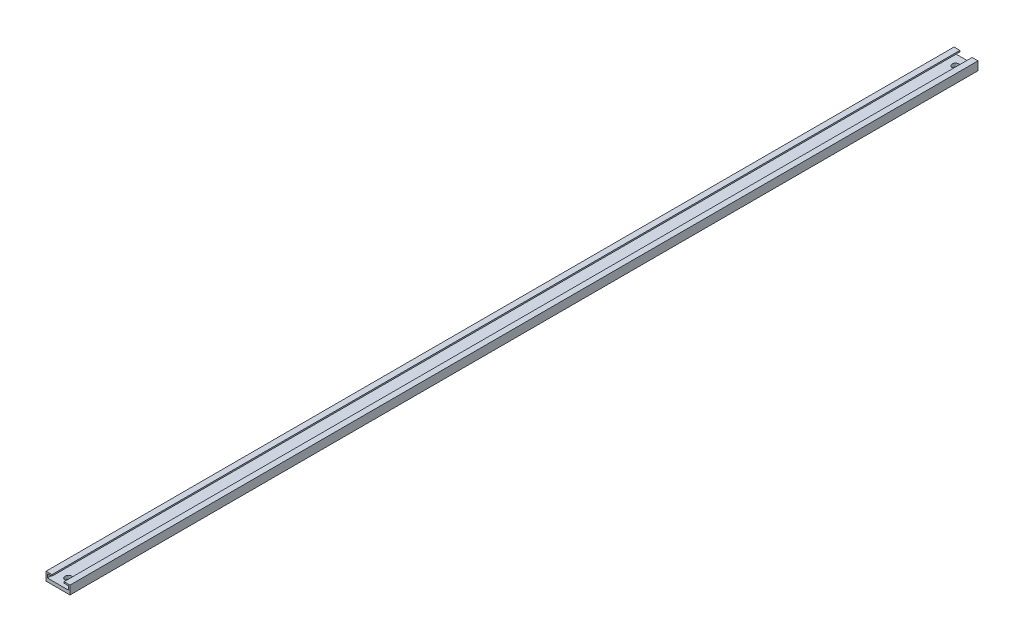
ISO-10303-21;
HEADER;
FILE_DESCRIPTION(('STEP AP214'),'2;1');
FILE_NAME('part.step','',(''),(''),'','','');
FILE_SCHEMA(('AUTOMOTIVE_DESIGN { 1 0 10303 214 1 1 1 1 }'));
ENDSEC;
DATA;
#1=APPLICATION_CONTEXT('core data for automotive mechanical design processes');
#2=APPLICATION_PROTOCOL_DEFINITION('international standard','automotive_design',2000,#1);
#3=PRODUCT_CONTEXT('',#1,'mechanical');
#4=PRODUCT('Part','Part','',(#3));
#5=PRODUCT_RELATED_PRODUCT_CATEGORY('part','',(#4));
#6=PRODUCT_DEFINITION_FORMATION('','',#4);
#7=PRODUCT_DEFINITION_CONTEXT('part definition',#1,'design');
#8=PRODUCT_DEFINITION('design','',#6,#7);
#9=PRODUCT_DEFINITION_SHAPE('','',#8);
#10=(LENGTH_UNIT() NAMED_UNIT(*) SI_UNIT(.MILLI.,.METRE.));
#11=(NAMED_UNIT(*) PLANE_ANGLE_UNIT() SI_UNIT($,.RADIAN.));
#12=(NAMED_UNIT(*) SI_UNIT($,.STERADIAN.) SOLID_ANGLE_UNIT());
#13=UNCERTAINTY_MEASURE_WITH_UNIT(LENGTH_MEASURE(1.E-05),#10,'distance_accuracy_value','');
#14=(GEOMETRIC_REPRESENTATION_CONTEXT(3) GLOBAL_UNCERTAINTY_ASSIGNED_CONTEXT((#13)) GLOBAL_UNIT_ASSIGNED_CONTEXT((#10,
#11,#12)) REPRESENTATION_CONTEXT('',''));
#15=CARTESIAN_POINT('',(0.,0.,0.));
#16=DIRECTION('',(0.,0.,1.));
#17=DIRECTION('',(1.,0.,0.));
#18=AXIS2_PLACEMENT_3D('',#15,#16,#17);
#19=CARTESIAN_POINT('',(-4.4,3.1,655.));
#20=DIRECTION('',(0.,-1.,0.));
#21=DIRECTION('',(1.,0.,0.));
#22=AXIS2_PLACEMENT_3D('',#19,#20,#21);
#23=PLANE('',#22);
#24=DIRECTION('',(-1.,0.,0.));
#25=VECTOR('',#24,1.);
#26=CARTESIAN_POINT('',(-4.4,3.1,0.));
#27=LINE('',#26,#25);
#28=CARTESIAN_POINT('',(-4.4,3.1,0.));
#29=VERTEX_POINT('',#28);
#30=CARTESIAN_POINT('',(-8.65,3.1,0.));
#31=VERTEX_POINT('',#30);
#32=EDGE_CURVE('E155',#29,#31,#27,.T.);
#33=ORIENTED_EDGE('',*,*,#32,.T.);
#34=DIRECTION('',(0.,0.,-1.));
#35=VECTOR('',#34,1.);
#36=CARTESIAN_POINT('',(-8.65,3.1,655.));
#37=LINE('',#36,#35);
#38=CARTESIAN_POINT('',(-8.65,3.1,655.));
#39=VERTEX_POINT('',#38);
#40=EDGE_CURVE('E11',#39,#31,#37,.T.);
#41=ORIENTED_EDGE('',*,*,#40,.F.);
#42=DIRECTION('',(-1.,0.,0.));
#43=VECTOR('',#42,1.);
#44=CARTESIAN_POINT('',(-4.4,3.1,655.));
#45=LINE('',#44,#43);
#46=CARTESIAN_POINT('',(-4.4,3.1,655.));
#47=VERTEX_POINT('',#46);
#48=EDGE_CURVE('E178',#47,#39,#45,.T.);
#49=ORIENTED_EDGE('',*,*,#48,.F.);
#50=DIRECTION('',(0.,0.,-1.));
#51=VECTOR('',#50,1.);
#52=CARTESIAN_POINT('',(-4.4,3.1,655.));
#53=LINE('',#52,#51);
#54=EDGE_CURVE('E151',#47,#29,#53,.T.);
#55=ORIENTED_EDGE('',*,*,#54,.T.);
#56=EDGE_LOOP('',(#33,#41,#49,#55));
#57=FACE_BOUND('',#56,.T.);
#58=ADVANCED_FACE('F35',(#57),#23,.F.);
#59=CARTESIAN_POINT('',(-8.65,-3.1,655.));
#60=DIRECTION('',(1.,0.,0.));
#61=DIRECTION('',(0.,0.,-1.));
#62=AXIS2_PLACEMENT_3D('',#59,#60,#61);
#63=PLANE('',#62);
#64=DIRECTION('',(0.,-1.,0.));
#65=VECTOR('',#64,1.);
#66=CARTESIAN_POINT('',(-8.65,-3.1,0.));
#67=LINE('',#66,#65);
#68=CARTESIAN_POINT('',(-8.65,-3.1,0.));
#69=VERTEX_POINT('',#68);
#70=EDGE_CURVE('E158',#31,#69,#67,.T.);
#71=ORIENTED_EDGE('',*,*,#70,.T.);
#72=DIRECTION('',(0.,0.,-1.));
#73=VECTOR('',#72,1.);
#74=CARTESIAN_POINT('',(-8.65,-3.1,655.));
#75=LINE('',#74,#73);
#76=CARTESIAN_POINT('',(-8.65,-3.1,655.));
#77=VERTEX_POINT('',#76);
#78=EDGE_CURVE('E43',#77,#69,#75,.T.);
#79=ORIENTED_EDGE('',*,*,#78,.F.);
#80=DIRECTION('',(0.,-1.,0.));
#81=VECTOR('',#80,1.);
#82=CARTESIAN_POINT('',(-8.65,-3.1,655.));
#83=LINE('',#82,#81);
#84=EDGE_CURVE('E106',#39,#77,#83,.T.);
#85=ORIENTED_EDGE('',*,*,#84,.F.);
#86=ORIENTED_EDGE('',*,*,#40,.T.);
#87=EDGE_LOOP('',(#71,#79,#85,#86));
#88=FACE_BOUND('',#87,.T.);
#89=ADVANCED_FACE('F256',(#88),#63,.F.);
#90=CARTESIAN_POINT('',(8.65,-3.1,655.));
#91=DIRECTION('',(0.,1.,0.));
#92=DIRECTION('',(-1.,0.,0.));
#93=AXIS2_PLACEMENT_3D('',#90,#91,#92);
#94=PLANE('',#93);
#95=CARTESIAN_POINT('',(0.,-3.1,7.49999999999984));
#96=DIRECTION('',(0.,1.,0.));
#97=DIRECTION('',(1.,0.,0.));
#98=AXIS2_PLACEMENT_3D('',#95,#96,#97);
#99=CIRCLE('',#98,2.3999999999999);
#100=CARTESIAN_POINT('',(2.3999999999999,-3.1,7.49999999999984));
#101=VERTEX_POINT('',#100);
#102=EDGE_CURVE('E350',#101,#101,#99,.T.);
#103=ORIENTED_EDGE('',*,*,#102,.T.);
#104=EDGE_LOOP('',(#103));
#105=FACE_BOUND('',#104,.T.);
#106=CARTESIAN_POINT('',(0.,-3.1,647.5));
#107=DIRECTION('',(0.,-1.,0.));
#108=DIRECTION('',(1.,0.,0.));
#109=AXIS2_PLACEMENT_3D('',#106,#107,#108);
#110=CIRCLE('',#109,2.3999999999999);
#111=CARTESIAN_POINT('',(2.3999999999999,-3.1,647.5));
#112=VERTEX_POINT('',#111);
#113=EDGE_CURVE('E355',#112,#112,#110,.T.);
#114=ORIENTED_EDGE('',*,*,#113,.F.);
#115=EDGE_LOOP('',(#114));
#116=FACE_BOUND('',#115,.T.);
#117=DIRECTION('',(1.,0.,0.));
#118=VECTOR('',#117,1.);
#119=CARTESIAN_POINT('',(8.65,-3.1,0.));
#120=LINE('',#119,#118);
#121=CARTESIAN_POINT('',(8.65,-3.1,0.));
#122=VERTEX_POINT('',#121);
#123=EDGE_CURVE('E161',#69,#122,#120,.T.);
#124=ORIENTED_EDGE('',*,*,#123,.T.);
#125=DIRECTION('',(0.,0.,-1.));
#126=VECTOR('',#125,1.);
#127=CARTESIAN_POINT('',(8.65,-3.1,655.));
#128=LINE('',#127,#126);
#129=CARTESIAN_POINT('',(8.65,-3.1,655.));
#130=VERTEX_POINT('',#129);
#131=EDGE_CURVE('E197',#130,#122,#128,.T.);
#132=ORIENTED_EDGE('',*,*,#131,.F.);
#133=DIRECTION('',(1.,0.,0.));
#134=VECTOR('',#133,1.);
#135=CARTESIAN_POINT('',(8.65,-3.1,655.));
#136=LINE('',#135,#134);
#137=EDGE_CURVE('E205',#77,#130,#136,.T.);
#138=ORIENTED_EDGE('',*,*,#137,.F.);
#139=ORIENTED_EDGE('',*,*,#78,.T.);
#140=EDGE_LOOP('',(#124,#132,#138,#139));
#141=FACE_BOUND('',#140,.T.);
#142=ADVANCED_FACE('F203',(#105,#116,#141),#94,.F.);
#143=CARTESIAN_POINT('',(8.65,-3.1,655.));
#144=DIRECTION('',(-1.,0.,0.));
#145=DIRECTION('',(0.,0.,1.));
#146=AXIS2_PLACEMENT_3D('',#143,#144,#145);
#147=PLANE('',#146);
#148=DIRECTION('',(0.,1.,0.));
#149=VECTOR('',#148,1.);
#150=CARTESIAN_POINT('',(8.65,-3.1,0.));
#151=LINE('',#150,#149);
#152=CARTESIAN_POINT('',(8.65,3.1,0.));
#153=VERTEX_POINT('',#152);
#154=EDGE_CURVE('E163',#122,#153,#151,.T.);
#155=ORIENTED_EDGE('',*,*,#154,.T.);
#156=DIRECTION('',(0.,0.,-1.));
#157=VECTOR('',#156,1.);
#158=CARTESIAN_POINT('',(8.65,3.1,655.));
#159=LINE('',#158,#157);
#160=CARTESIAN_POINT('',(8.65,3.1,655.));
#161=VERTEX_POINT('',#160);
#162=EDGE_CURVE('E194',#161,#153,#159,.T.);
#163=ORIENTED_EDGE('',*,*,#162,.F.);
#164=DIRECTION('',(0.,1.,0.));
#165=VECTOR('',#164,1.);
#166=CARTESIAN_POINT('',(8.65,-3.1,655.));
#167=LINE('',#166,#165);
#168=EDGE_CURVE('E223',#130,#161,#167,.T.);
#169=ORIENTED_EDGE('',*,*,#168,.F.);
#170=ORIENTED_EDGE('',*,*,#131,.T.);
#171=EDGE_LOOP('',(#155,#163,#169,#170));
#172=FACE_BOUND('',#171,.T.);
#173=ADVANCED_FACE('F214',(#172),#147,.F.);
#174=CARTESIAN_POINT('',(8.65,3.1,655.));
#175=DIRECTION('',(0.,-1.,0.));
#176=DIRECTION('',(1.,0.,0.));
#177=AXIS2_PLACEMENT_3D('',#174,#175,#176);
#178=PLANE('',#177);
#179=DIRECTION('',(-1.,0.,0.));
#180=VECTOR('',#179,1.);
#181=CARTESIAN_POINT('',(8.65,3.1,0.));
#182=LINE('',#181,#180);
#183=CARTESIAN_POINT('',(4.4,3.1,0.));
#184=VERTEX_POINT('',#183);
#185=EDGE_CURVE('E165',#153,#184,#182,.T.);
#186=ORIENTED_EDGE('',*,*,#185,.T.);
#187=DIRECTION('',(0.,0.,-1.));
#188=VECTOR('',#187,1.);
#189=CARTESIAN_POINT('',(4.4,3.1,655.));
#190=LINE('',#189,#188);
#191=CARTESIAN_POINT('',(4.4,3.1,655.));
#192=VERTEX_POINT('',#191);
#193=EDGE_CURVE('E191',#192,#184,#190,.T.);
#194=ORIENTED_EDGE('',*,*,#193,.F.);
#195=DIRECTION('',(-1.,0.,0.));
#196=VECTOR('',#195,1.);
#197=CARTESIAN_POINT('',(8.65,3.1,655.));
#198=LINE('',#197,#196);
#199=EDGE_CURVE('E220',#161,#192,#198,.T.);
#200=ORIENTED_EDGE('',*,*,#199,.F.);
#201=ORIENTED_EDGE('',*,*,#162,.T.);
#202=EDGE_LOOP('',(#186,#194,#200,#201));
#203=FACE_BOUND('',#202,.T.);
#204=ADVANCED_FACE('F218',(#203),#178,.F.);
#205=CARTESIAN_POINT('',(4.4,3.1,655.));
#206=DIRECTION('',(1.,0.,0.));
#207=DIRECTION('',(0.,1.,0.));
#208=AXIS2_PLACEMENT_3D('',#205,#206,#207);
#209=PLANE('',#208);
#210=DIRECTION('',(0.,-1.,0.));
#211=VECTOR('',#210,1.);
#212=CARTESIAN_POINT('',(4.4,3.1,0.));
#213=LINE('',#212,#211);
#214=CARTESIAN_POINT('',(4.4,2.1,0.));
#215=VERTEX_POINT('',#214);
#216=EDGE_CURVE('E167',#184,#215,#213,.T.);
#217=ORIENTED_EDGE('',*,*,#216,.T.);
#218=DIRECTION('',(0.,0.,-1.));
#219=VECTOR('',#218,1.);
#220=CARTESIAN_POINT('',(4.4,2.1,655.));
#221=LINE('',#220,#219);
#222=CARTESIAN_POINT('',(4.4,2.1,655.));
#223=VERTEX_POINT('',#222);
#224=EDGE_CURVE('E188',#223,#215,#221,.T.);
#225=ORIENTED_EDGE('',*,*,#224,.F.);
#226=DIRECTION('',(0.,-1.,0.));
#227=VECTOR('',#226,1.);
#228=CARTESIAN_POINT('',(4.4,3.1,655.));
#229=LINE('',#228,#227);
#230=EDGE_CURVE('E222',#192,#223,#229,.T.);
#231=ORIENTED_EDGE('',*,*,#230,.F.);
#232=ORIENTED_EDGE('',*,*,#193,.T.);
#233=EDGE_LOOP('',(#217,#225,#231,#232));
#234=FACE_BOUND('',#233,.T.);
#235=ADVANCED_FACE('F270',(#234),#209,.F.);
#236=CARTESIAN_POINT('',(7.65,2.1,655.));
#237=DIRECTION('',(0.,1.,0.));
#238=DIRECTION('',(0.,0.,1.));
#239=AXIS2_PLACEMENT_3D('',#236,#237,#238);
#240=PLANE('',#239);
#241=DIRECTION('',(1.,0.,0.));
#242=VECTOR('',#241,1.);
#243=CARTESIAN_POINT('',(7.65,2.1,0.));
#244=LINE('',#243,#242);
#245=CARTESIAN_POINT('',(7.65,2.1,0.));
#246=VERTEX_POINT('',#245);
#247=EDGE_CURVE('E169',#215,#246,#244,.T.);
#248=ORIENTED_EDGE('',*,*,#247,.T.);
#249=DIRECTION('',(0.,0.,-1.));
#250=VECTOR('',#249,1.);
#251=CARTESIAN_POINT('',(7.65,2.1,655.));
#252=LINE('',#251,#250);
#253=CARTESIAN_POINT('',(7.65,2.1,655.));
#254=VERTEX_POINT('',#253);
#255=EDGE_CURVE('E185',#254,#246,#252,.T.);
#256=ORIENTED_EDGE('',*,*,#255,.F.);
#257=DIRECTION('',(1.,0.,0.));
#258=VECTOR('',#257,1.);
#259=CARTESIAN_POINT('',(7.65,2.1,655.));
#260=LINE('',#259,#258);
#261=EDGE_CURVE('E225',#223,#254,#260,.T.);
#262=ORIENTED_EDGE('',*,*,#261,.F.);
#263=ORIENTED_EDGE('',*,*,#224,.T.);
#264=EDGE_LOOP('',(#248,#256,#262,#263));
#265=FACE_BOUND('',#264,.T.);
#266=ADVANCED_FACE('F273',(#265),#240,.F.);
#267=CARTESIAN_POINT('',(7.65,2.1,655.));
#268=DIRECTION('',(1.,0.,0.));
#269=DIRECTION('',(0.,1.,0.));
#270=AXIS2_PLACEMENT_3D('',#267,#268,#269);
#271=PLANE('',#270);
#272=DIRECTION('',(0.,-1.,0.));
#273=VECTOR('',#272,1.);
#274=CARTESIAN_POINT('',(7.65,2.1,0.));
#275=LINE('',#274,#273);
#276=CARTESIAN_POINT('',(7.65,-0.600000000000001,0.));
#277=VERTEX_POINT('',#276);
#278=EDGE_CURVE('E171',#246,#277,#275,.T.);
#279=ORIENTED_EDGE('',*,*,#278,.T.);
#280=DIRECTION('',(0.,0.,-1.));
#281=VECTOR('',#280,1.);
#282=CARTESIAN_POINT('',(7.65,-0.600000000000001,655.));
#283=LINE('',#282,#281);
#284=CARTESIAN_POINT('',(7.65,-0.600000000000001,655.));
#285=VERTEX_POINT('',#284);
#286=EDGE_CURVE('E182',#285,#277,#283,.T.);
#287=ORIENTED_EDGE('',*,*,#286,.F.);
#288=DIRECTION('',(0.,-1.,0.));
#289=VECTOR('',#288,1.);
#290=CARTESIAN_POINT('',(7.65,2.1,655.));
#291=LINE('',#290,#289);
#292=EDGE_CURVE('E231',#254,#285,#291,.T.);
#293=ORIENTED_EDGE('',*,*,#292,.F.);
#294=ORIENTED_EDGE('',*,*,#255,.T.);
#295=EDGE_LOOP('',(#279,#287,#293,#294));
#296=FACE_BOUND('',#295,.T.);
#297=ADVANCED_FACE('F237',(#296),#271,.F.);
#298=CARTESIAN_POINT('',(7.65,-0.600000000000001,655.));
#299=DIRECTION('',(0.,-1.,0.));
#300=DIRECTION('',(0.,0.,-1.));
#301=AXIS2_PLACEMENT_3D('',#298,#299,#300);
#302=PLANE('',#301);
#303=CARTESIAN_POINT('',(0.,-0.6,7.49999999999984));
#304=DIRECTION('',(0.,-1.,0.));
#305=DIRECTION('',(0.,0.,-1.));
#306=AXIS2_PLACEMENT_3D('',#303,#304,#305);
#307=CIRCLE('',#306,2.3999999999999);
#308=CARTESIAN_POINT('',(0.,-0.6,5.09999999999994));
#309=VERTEX_POINT('',#308);
#310=EDGE_CURVE('E353',#309,#309,#307,.T.);
#311=ORIENTED_EDGE('',*,*,#310,.T.);
#312=EDGE_LOOP('',(#311));
#313=FACE_BOUND('',#312,.T.);
#314=CARTESIAN_POINT('',(0.,-0.6,647.5));
#315=DIRECTION('',(0.,-1.,0.));
#316=DIRECTION('',(0.,0.,-1.));
#317=AXIS2_PLACEMENT_3D('',#314,#315,#316);
#318=CIRCLE('',#317,2.3999999999999);
#319=CARTESIAN_POINT('',(0.,-0.6,645.1));
#320=VERTEX_POINT('',#319);
#321=EDGE_CURVE('E159',#320,#320,#318,.F.);
#322=ORIENTED_EDGE('',*,*,#321,.F.);
#323=EDGE_LOOP('',(#322));
#324=FACE_BOUND('',#323,.T.);
#325=DIRECTION('',(-1.,0.,0.));
#326=VECTOR('',#325,1.);
#327=CARTESIAN_POINT('',(7.65,-0.600000000000001,0.));
#328=LINE('',#327,#326);
#329=CARTESIAN_POINT('',(-7.65,-0.600000000000001,0.));
#330=VERTEX_POINT('',#329);
#331=EDGE_CURVE('E173',#277,#330,#328,.T.);
#332=ORIENTED_EDGE('',*,*,#331,.T.);
#333=DIRECTION('',(0.,0.,-1.));
#334=VECTOR('',#333,1.);
#335=CARTESIAN_POINT('',(-7.65,-0.600000000000001,655.));
#336=LINE('',#335,#334);
#337=CARTESIAN_POINT('',(-7.65,-0.600000000000001,655.));
#338=VERTEX_POINT('',#337);
#339=EDGE_CURVE('E146',#338,#330,#336,.T.);
#340=ORIENTED_EDGE('',*,*,#339,.F.);
#341=DIRECTION('',(-1.,0.,0.));
#342=VECTOR('',#341,1.);
#343=CARTESIAN_POINT('',(7.65,-0.600000000000001,655.));
#344=LINE('',#343,#342);
#345=EDGE_CURVE('E137',#285,#338,#344,.T.);
#346=ORIENTED_EDGE('',*,*,#345,.F.);
#347=ORIENTED_EDGE('',*,*,#286,.T.);
#348=EDGE_LOOP('',(#332,#340,#346,#347));
#349=FACE_BOUND('',#348,.T.);
#350=ADVANCED_FACE('F241',(#313,#324,#349),#302,.F.);
#351=CARTESIAN_POINT('',(-7.65,2.1,655.));
#352=DIRECTION('',(-1.,0.,0.));
#353=DIRECTION('',(0.,-1.,0.));
#354=AXIS2_PLACEMENT_3D('',#351,#352,#353);
#355=PLANE('',#354);
#356=DIRECTION('',(0.,1.,0.));
#357=VECTOR('',#356,1.);
#358=CARTESIAN_POINT('',(-7.65,2.1,0.));
#359=LINE('',#358,#357);
#360=CARTESIAN_POINT('',(-7.65,2.1,0.));
#361=VERTEX_POINT('',#360);
#362=EDGE_CURVE('E145',#330,#361,#359,.T.);
#363=ORIENTED_EDGE('',*,*,#362,.T.);
#364=DIRECTION('',(0.,0.,-1.));
#365=VECTOR('',#364,1.);
#366=CARTESIAN_POINT('',(-7.65,2.1,655.));
#367=LINE('',#366,#365);
#368=CARTESIAN_POINT('',(-7.65,2.1,655.));
#369=VERTEX_POINT('',#368);
#370=EDGE_CURVE('E142',#369,#361,#367,.T.);
#371=ORIENTED_EDGE('',*,*,#370,.F.);
#372=DIRECTION('',(0.,1.,0.));
#373=VECTOR('',#372,1.);
#374=CARTESIAN_POINT('',(-7.65,2.1,655.));
#375=LINE('',#374,#373);
#376=EDGE_CURVE('E131',#338,#369,#375,.T.);
#377=ORIENTED_EDGE('',*,*,#376,.F.);
#378=ORIENTED_EDGE('',*,*,#339,.T.);
#379=EDGE_LOOP('',(#363,#371,#377,#378));
#380=FACE_BOUND('',#379,.T.);
#381=ADVANCED_FACE('F143',(#380),#355,.F.);
#382=CARTESIAN_POINT('',(-4.4,2.1,655.));
#383=DIRECTION('',(0.,1.,0.));
#384=DIRECTION('',(0.,0.,1.));
#385=AXIS2_PLACEMENT_3D('',#382,#383,#384);
#386=PLANE('',#385);
#387=DIRECTION('',(1.,0.,0.));
#388=VECTOR('',#387,1.);
#389=CARTESIAN_POINT('',(-4.4,2.1,0.));
#390=LINE('',#389,#388);
#391=CARTESIAN_POINT('',(-4.4,2.1,0.));
#392=VERTEX_POINT('',#391);
#393=EDGE_CURVE('E92',#361,#392,#390,.T.);
#394=ORIENTED_EDGE('',*,*,#393,.T.);
#395=DIRECTION('',(0.,0.,-1.));
#396=VECTOR('',#395,1.);
#397=CARTESIAN_POINT('',(-4.4,2.1,655.));
#398=LINE('',#397,#396);
#399=CARTESIAN_POINT('',(-4.4,2.1,655.));
#400=VERTEX_POINT('',#399);
#401=EDGE_CURVE('E147',#400,#392,#398,.T.);
#402=ORIENTED_EDGE('',*,*,#401,.F.);
#403=DIRECTION('',(1.,0.,0.));
#404=VECTOR('',#403,1.);
#405=CARTESIAN_POINT('',(-4.4,2.1,655.));
#406=LINE('',#405,#404);
#407=EDGE_CURVE('E135',#369,#400,#406,.T.);
#408=ORIENTED_EDGE('',*,*,#407,.F.);
#409=ORIENTED_EDGE('',*,*,#370,.T.);
#410=EDGE_LOOP('',(#394,#402,#408,#409));
#411=FACE_BOUND('',#410,.T.);
#412=ADVANCED_FACE('F149',(#411),#386,.F.);
#413=CARTESIAN_POINT('',(-4.4,3.1,655.));
#414=DIRECTION('',(-1.,0.,0.));
#415=DIRECTION('',(0.,-1.,0.));
#416=AXIS2_PLACEMENT_3D('',#413,#414,#415);
#417=PLANE('',#416);
#418=DIRECTION('',(0.,1.,0.));
#419=VECTOR('',#418,1.);
#420=CARTESIAN_POINT('',(-4.4,3.1,0.));
#421=LINE('',#420,#419);
#422=EDGE_CURVE('E98',#392,#29,#421,.T.);
#423=ORIENTED_EDGE('',*,*,#422,.T.);
#424=ORIENTED_EDGE('',*,*,#54,.F.);
#425=DIRECTION('',(0.,1.,0.));
#426=VECTOR('',#425,1.);
#427=CARTESIAN_POINT('',(-4.4,3.1,655.));
#428=LINE('',#427,#426);
#429=EDGE_CURVE('E51',#400,#47,#428,.T.);
#430=ORIENTED_EDGE('',*,*,#429,.F.);
#431=ORIENTED_EDGE('',*,*,#401,.T.);
#432=EDGE_LOOP('',(#423,#424,#430,#431));
#433=FACE_BOUND('',#432,.T.);
#434=ADVANCED_FACE('F245',(#433),#417,.F.);
#435=CARTESIAN_POINT('',(0.,0.,655.));
#436=DIRECTION('',(0.,0.,-1.));
#437=DIRECTION('',(-1.,0.,0.));
#438=AXIS2_PLACEMENT_3D('',#435,#436,#437);
#439=PLANE('',#438);
#440=ORIENTED_EDGE('',*,*,#48,.T.);
#441=ORIENTED_EDGE('',*,*,#84,.T.);
#442=ORIENTED_EDGE('',*,*,#137,.T.);
#443=ORIENTED_EDGE('',*,*,#168,.T.);
#444=ORIENTED_EDGE('',*,*,#199,.T.);
#445=ORIENTED_EDGE('',*,*,#230,.T.);
#446=ORIENTED_EDGE('',*,*,#261,.T.);
#447=ORIENTED_EDGE('',*,*,#292,.T.);
#448=ORIENTED_EDGE('',*,*,#345,.T.);
#449=ORIENTED_EDGE('',*,*,#376,.T.);
#450=ORIENTED_EDGE('',*,*,#407,.T.);
#451=ORIENTED_EDGE('',*,*,#429,.T.);
#452=EDGE_LOOP('',(#440,#441,#442,#443,#444,#445,#446,#447,#448,#449,#450,#451));
#453=FACE_BOUND('',#452,.T.);
#454=ADVANCED_FACE('F133',(#453),#439,.F.);
#455=CARTESIAN_POINT('',(0.,0.,0.));
#456=DIRECTION('',(0.,0.,-1.));
#457=DIRECTION('',(-1.,0.,0.));
#458=AXIS2_PLACEMENT_3D('',#455,#456,#457);
#459=PLANE('',#458);
#460=ORIENTED_EDGE('',*,*,#32,.F.);
#461=ORIENTED_EDGE('',*,*,#422,.F.);
#462=ORIENTED_EDGE('',*,*,#393,.F.);
#463=ORIENTED_EDGE('',*,*,#362,.F.);
#464=ORIENTED_EDGE('',*,*,#331,.F.);
#465=ORIENTED_EDGE('',*,*,#278,.F.);
#466=ORIENTED_EDGE('',*,*,#247,.F.);
#467=ORIENTED_EDGE('',*,*,#216,.F.);
#468=ORIENTED_EDGE('',*,*,#185,.F.);
#469=ORIENTED_EDGE('',*,*,#154,.F.);
#470=ORIENTED_EDGE('',*,*,#123,.F.);
#471=ORIENTED_EDGE('',*,*,#70,.F.);
#472=EDGE_LOOP('',(#460,#461,#462,#463,#464,#465,#466,#467,#468,#469,#470,#471));
#473=FACE_BOUND('',#472,.T.);
#474=ADVANCED_FACE('F209',(#473),#459,.T.);
#475=CARTESIAN_POINT('',(0.,3.10100000000001,647.5));
#476=DIRECTION('',(0.,-1.,0.));
#477=DIRECTION('',(1.,0.,0.));
#478=AXIS2_PLACEMENT_3D('',#475,#476,#477);
#479=CYLINDRICAL_SURFACE('',#478,2.3999999999999);
#480=ORIENTED_EDGE('',*,*,#113,.T.);
#481=EDGE_LOOP('',(#480));
#482=FACE_BOUND('',#481,.T.);
#483=ORIENTED_EDGE('',*,*,#321,.T.);
#484=EDGE_LOOP('',(#483));
#485=FACE_BOUND('',#484,.T.);
#486=ADVANCED_FACE('F312',(#482,#485),#479,.F.);
#487=CARTESIAN_POINT('',(0.,3.10100000000001,7.49999999999984));
#488=DIRECTION('',(0.,-1.,0.));
#489=DIRECTION('',(1.,0.,0.));
#490=AXIS2_PLACEMENT_3D('',#487,#488,#489);
#491=CYLINDRICAL_SURFACE('',#490,2.3999999999999);
#492=ORIENTED_EDGE('',*,*,#102,.F.);
#493=EDGE_LOOP('',(#492));
#494=FACE_BOUND('',#493,.T.);
#495=ORIENTED_EDGE('',*,*,#310,.F.);
#496=EDGE_LOOP('',(#495));
#497=FACE_BOUND('',#496,.T.);
#498=ADVANCED_FACE('F320',(#494,#497),#491,.F.);
#499=CLOSED_SHELL('',(#58,#89,#142,#173,#204,#235,#266,#297,#350,#381,#412,#434,#454,#474,#486,#498));
#500=MANIFOLD_SOLID_BREP('B2',#499);
#501=ADVANCED_BREP_SHAPE_REPRESENTATION('',(#18,#500),#14);
#502=SHAPE_DEFINITION_REPRESENTATION(#9,#501);
ENDSEC;
END-ISO-10303-21;
